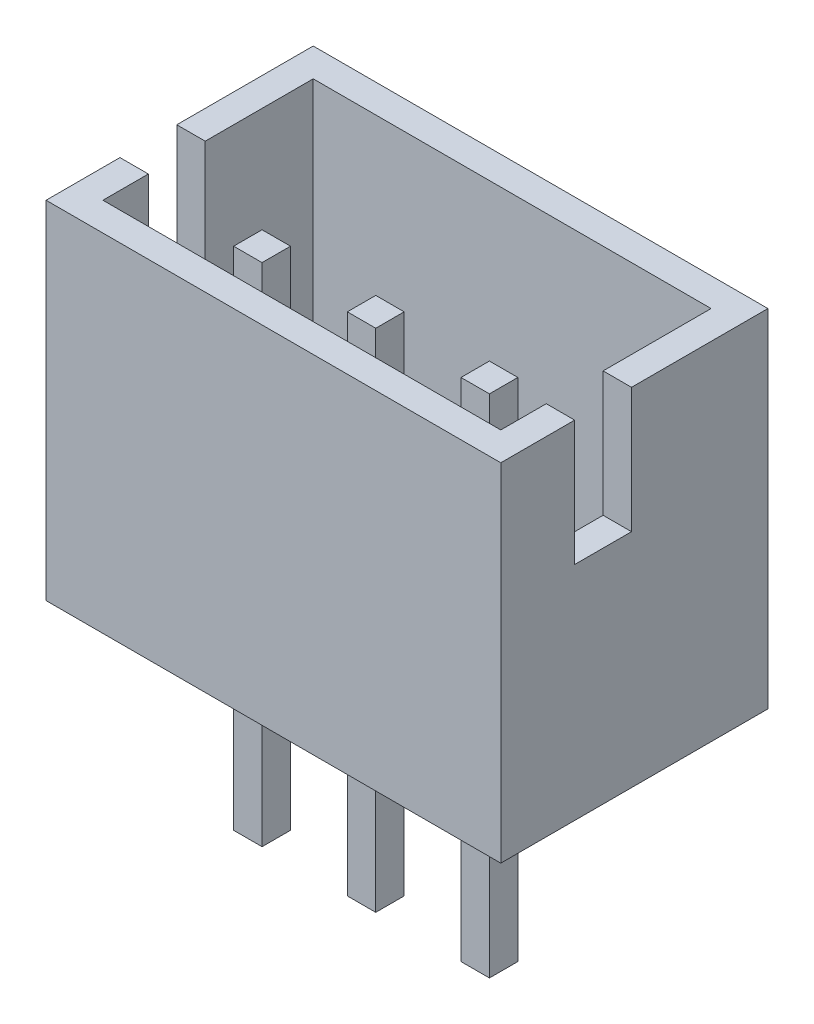
ISO-10303-21;
HEADER;
FILE_DESCRIPTION(('STEP AP214'),'2;1');
FILE_NAME('part.step','',(''),(''),'','','');
FILE_SCHEMA(('AUTOMOTIVE_DESIGN { 1 0 10303 214 1 1 1 1 }'));
ENDSEC;
DATA;
#1=APPLICATION_CONTEXT('core data for automotive mechanical design processes');
#2=APPLICATION_PROTOCOL_DEFINITION('international standard','automotive_design',2000,#1);
#3=PRODUCT_CONTEXT('',#1,'mechanical');
#4=PRODUCT('Part','Part','',(#3));
#5=PRODUCT_RELATED_PRODUCT_CATEGORY('part','',(#4));
#6=PRODUCT_DEFINITION_FORMATION('','',#4);
#7=PRODUCT_DEFINITION_CONTEXT('part definition',#1,'design');
#8=PRODUCT_DEFINITION('design','',#6,#7);
#9=PRODUCT_DEFINITION_SHAPE('','',#8);
#10=(LENGTH_UNIT() NAMED_UNIT(*) SI_UNIT(.MILLI.,.METRE.));
#11=(NAMED_UNIT(*) PLANE_ANGLE_UNIT() SI_UNIT($,.RADIAN.));
#12=(NAMED_UNIT(*) SI_UNIT($,.STERADIAN.) SOLID_ANGLE_UNIT());
#13=UNCERTAINTY_MEASURE_WITH_UNIT(LENGTH_MEASURE(1.E-05),#10,'distance_accuracy_value','');
#14=(GEOMETRIC_REPRESENTATION_CONTEXT(3) GLOBAL_UNCERTAINTY_ASSIGNED_CONTEXT((#13)) GLOBAL_UNIT_ASSIGNED_CONTEXT((#10,
#11,#12)) REPRESENTATION_CONTEXT('',''));
#15=CARTESIAN_POINT('',(0.,0.,0.));
#16=DIRECTION('',(0.,0.,1.));
#17=DIRECTION('',(1.,0.,0.));
#18=AXIS2_PLACEMENT_3D('',#15,#16,#17);
#19=CARTESIAN_POINT('',(2.25,-3.4,0.3));
#20=DIRECTION('',(0.,0.,-1.));
#21=DIRECTION('',(-1.,0.,0.));
#22=AXIS2_PLACEMENT_3D('',#19,#20,#21);
#23=PLANE('',#22);
#24=DIRECTION('',(0.,1.,0.));
#25=VECTOR('',#24,1.);
#26=CARTESIAN_POINT('',(1.75,-3.4,0.3));
#27=LINE('',#26,#25);
#28=CARTESIAN_POINT('',(1.75,-3.4,0.3));
#29=VERTEX_POINT('',#28);
#30=CARTESIAN_POINT('',(1.75,5.5,0.3));
#31=VERTEX_POINT('',#30);
#32=EDGE_CURVE('E48',#29,#31,#27,.T.);
#33=ORIENTED_EDGE('',*,*,#32,.T.);
#34=DIRECTION('',(-1.,0.,0.));
#35=VECTOR('',#34,1.);
#36=CARTESIAN_POINT('',(2.25,5.5,0.3));
#37=LINE('',#36,#35);
#38=CARTESIAN_POINT('',(2.25,5.5,0.3));
#39=VERTEX_POINT('',#38);
#40=EDGE_CURVE('E85',#39,#31,#37,.T.);
#41=ORIENTED_EDGE('',*,*,#40,.F.);
#42=DIRECTION('',(0.,1.,0.));
#43=VECTOR('',#42,1.);
#44=CARTESIAN_POINT('',(2.25,-3.4,0.3));
#45=LINE('',#44,#43);
#46=CARTESIAN_POINT('',(2.25,-3.4,0.3));
#47=VERTEX_POINT('',#46);
#48=EDGE_CURVE('E12',#47,#39,#45,.T.);
#49=ORIENTED_EDGE('',*,*,#48,.F.);
#50=DIRECTION('',(-1.,0.,0.));
#51=VECTOR('',#50,1.);
#52=CARTESIAN_POINT('',(2.25,-3.4,0.3));
#53=LINE('',#52,#51);
#54=EDGE_CURVE('E86',#47,#29,#53,.T.);
#55=ORIENTED_EDGE('',*,*,#54,.T.);
#56=EDGE_LOOP('',(#33,#41,#49,#55));
#57=FACE_BOUND('',#56,.T.);
#58=ADVANCED_FACE('F45',(#57),#23,.T.);
#59=CARTESIAN_POINT('',(2.25,-3.4,0.8));
#60=DIRECTION('',(1.,0.,0.));
#61=DIRECTION('',(0.,0.,-1.));
#62=AXIS2_PLACEMENT_3D('',#59,#60,#61);
#63=PLANE('',#62);
#64=ORIENTED_EDGE('',*,*,#48,.T.);
#65=DIRECTION('',(0.,0.,-1.));
#66=VECTOR('',#65,1.);
#67=CARTESIAN_POINT('',(2.25,5.5,0.8));
#68=LINE('',#67,#66);
#69=CARTESIAN_POINT('',(2.25,5.5,0.8));
#70=VERTEX_POINT('',#69);
#71=EDGE_CURVE('E102',#70,#39,#68,.T.);
#72=ORIENTED_EDGE('',*,*,#71,.F.);
#73=DIRECTION('',(0.,1.,0.));
#74=VECTOR('',#73,1.);
#75=CARTESIAN_POINT('',(2.25,-3.4,0.8));
#76=LINE('',#75,#74);
#77=CARTESIAN_POINT('',(2.25,-3.4,0.8));
#78=VERTEX_POINT('',#77);
#79=EDGE_CURVE('E53',#78,#70,#76,.T.);
#80=ORIENTED_EDGE('',*,*,#79,.F.);
#81=DIRECTION('',(0.,0.,-1.));
#82=VECTOR('',#81,1.);
#83=CARTESIAN_POINT('',(2.25,-3.4,0.8));
#84=LINE('',#83,#82);
#85=EDGE_CURVE('E91',#78,#47,#84,.T.);
#86=ORIENTED_EDGE('',*,*,#85,.T.);
#87=EDGE_LOOP('',(#64,#72,#80,#86));
#88=FACE_BOUND('',#87,.T.);
#89=ADVANCED_FACE('F117',(#88),#63,.T.);
#90=CARTESIAN_POINT('',(2.25,-3.4,0.8));
#91=DIRECTION('',(0.,0.,1.));
#92=DIRECTION('',(1.,0.,0.));
#93=AXIS2_PLACEMENT_3D('',#90,#91,#92);
#94=PLANE('',#93);
#95=ORIENTED_EDGE('',*,*,#79,.T.);
#96=DIRECTION('',(1.,0.,0.));
#97=VECTOR('',#96,1.);
#98=CARTESIAN_POINT('',(2.25,5.5,0.8));
#99=LINE('',#98,#97);
#100=CARTESIAN_POINT('',(1.75,5.5,0.8));
#101=VERTEX_POINT('',#100);
#102=EDGE_CURVE('E98',#101,#70,#99,.T.);
#103=ORIENTED_EDGE('',*,*,#102,.F.);
#104=DIRECTION('',(0.,1.,0.));
#105=VECTOR('',#104,1.);
#106=CARTESIAN_POINT('',(1.75,-3.4,0.8));
#107=LINE('',#106,#105);
#108=CARTESIAN_POINT('',(1.75,-3.4,0.8));
#109=VERTEX_POINT('',#108);
#110=EDGE_CURVE('E90',#109,#101,#107,.T.);
#111=ORIENTED_EDGE('',*,*,#110,.F.);
#112=DIRECTION('',(1.,0.,0.));
#113=VECTOR('',#112,1.);
#114=CARTESIAN_POINT('',(2.25,-3.4,0.8));
#115=LINE('',#114,#113);
#116=EDGE_CURVE('E110',#109,#78,#115,.T.);
#117=ORIENTED_EDGE('',*,*,#116,.T.);
#118=EDGE_LOOP('',(#95,#103,#111,#117));
#119=FACE_BOUND('',#118,.T.);
#120=ADVANCED_FACE('F114',(#119),#94,.T.);
#121=CARTESIAN_POINT('',(1.75,-3.4,0.8));
#122=DIRECTION('',(-1.,0.,0.));
#123=DIRECTION('',(0.,0.,1.));
#124=AXIS2_PLACEMENT_3D('',#121,#122,#123);
#125=PLANE('',#124);
#126=ORIENTED_EDGE('',*,*,#110,.T.);
#127=DIRECTION('',(0.,0.,1.));
#128=VECTOR('',#127,1.);
#129=CARTESIAN_POINT('',(1.75,5.5,0.8));
#130=LINE('',#129,#128);
#131=EDGE_CURVE('E93',#31,#101,#130,.T.);
#132=ORIENTED_EDGE('',*,*,#131,.F.);
#133=ORIENTED_EDGE('',*,*,#32,.F.);
#134=DIRECTION('',(0.,0.,1.));
#135=VECTOR('',#134,1.);
#136=CARTESIAN_POINT('',(1.75,-3.4,0.8));
#137=LINE('',#136,#135);
#138=EDGE_CURVE('E108',#29,#109,#137,.T.);
#139=ORIENTED_EDGE('',*,*,#138,.T.);
#140=EDGE_LOOP('',(#126,#132,#133,#139));
#141=FACE_BOUND('',#140,.T.);
#142=ADVANCED_FACE('F94',(#141),#125,.T.);
#143=CARTESIAN_POINT('',(0.,-3.4,0.));
#144=DIRECTION('',(0.,-1.,0.));
#145=DIRECTION('',(0.,0.,-1.));
#146=AXIS2_PLACEMENT_3D('',#143,#144,#145);
#147=PLANE('',#146);
#148=ORIENTED_EDGE('',*,*,#54,.F.);
#149=ORIENTED_EDGE('',*,*,#85,.F.);
#150=ORIENTED_EDGE('',*,*,#116,.F.);
#151=ORIENTED_EDGE('',*,*,#138,.F.);
#152=EDGE_LOOP('',(#148,#149,#150,#151));
#153=FACE_BOUND('',#152,.T.);
#154=ADVANCED_FACE('F119',(#153),#147,.T.);
#155=CARTESIAN_POINT('',(0.,5.5,0.));
#156=DIRECTION('',(0.,-1.,0.));
#157=DIRECTION('',(0.,0.,-1.));
#158=AXIS2_PLACEMENT_3D('',#155,#156,#157);
#159=PLANE('',#158);
#160=ORIENTED_EDGE('',*,*,#40,.T.);
#161=ORIENTED_EDGE('',*,*,#131,.T.);
#162=ORIENTED_EDGE('',*,*,#102,.T.);
#163=ORIENTED_EDGE('',*,*,#71,.T.);
#164=EDGE_LOOP('',(#160,#161,#162,#163));
#165=FACE_BOUND('',#164,.T.);
#166=ADVANCED_FACE('F101',(#165),#159,.F.);
#167=CLOSED_SHELL('',(#58,#89,#120,#142,#154,#166));
#168=MANIFOLD_SOLID_BREP('B2',#167);
#169=CARTESIAN_POINT('',(0.25,-3.4,0.3));
#170=DIRECTION('',(0.,0.,-1.));
#171=DIRECTION('',(-1.,0.,0.));
#172=AXIS2_PLACEMENT_3D('',#169,#170,#171);
#173=PLANE('',#172);
#174=DIRECTION('',(0.,1.,0.));
#175=VECTOR('',#174,1.);
#176=CARTESIAN_POINT('',(-0.25,-3.4,0.3));
#177=LINE('',#176,#175);
#178=CARTESIAN_POINT('',(-0.25,-3.4,0.3));
#179=VERTEX_POINT('',#178);
#180=CARTESIAN_POINT('',(-0.25,5.5,0.3));
#181=VERTEX_POINT('',#180);
#182=EDGE_CURVE('E181',#179,#181,#177,.T.);
#183=ORIENTED_EDGE('',*,*,#182,.T.);
#184=DIRECTION('',(-1.,0.,0.));
#185=VECTOR('',#184,1.);
#186=CARTESIAN_POINT('',(0.25,5.5,0.3));
#187=LINE('',#186,#185);
#188=CARTESIAN_POINT('',(0.25,5.5,0.3));
#189=VERTEX_POINT('',#188);
#190=EDGE_CURVE('E218',#189,#181,#187,.T.);
#191=ORIENTED_EDGE('',*,*,#190,.F.);
#192=DIRECTION('',(0.,1.,0.));
#193=VECTOR('',#192,1.);
#194=CARTESIAN_POINT('',(0.25,-3.4,0.3));
#195=LINE('',#194,#193);
#196=CARTESIAN_POINT('',(0.25,-3.4,0.3));
#197=VERTEX_POINT('',#196);
#198=EDGE_CURVE('E43',#197,#189,#195,.T.);
#199=ORIENTED_EDGE('',*,*,#198,.F.);
#200=DIRECTION('',(-1.,0.,0.));
#201=VECTOR('',#200,1.);
#202=CARTESIAN_POINT('',(0.25,-3.4,0.3));
#203=LINE('',#202,#201);
#204=EDGE_CURVE('E219',#197,#179,#203,.T.);
#205=ORIENTED_EDGE('',*,*,#204,.T.);
#206=EDGE_LOOP('',(#183,#191,#199,#205));
#207=FACE_BOUND('',#206,.T.);
#208=ADVANCED_FACE('F178',(#207),#173,.T.);
#209=CARTESIAN_POINT('',(0.25,-3.4,0.8));
#210=DIRECTION('',(1.,0.,0.));
#211=DIRECTION('',(0.,0.,-1.));
#212=AXIS2_PLACEMENT_3D('',#209,#210,#211);
#213=PLANE('',#212);
#214=ORIENTED_EDGE('',*,*,#198,.T.);
#215=DIRECTION('',(0.,0.,-1.));
#216=VECTOR('',#215,1.);
#217=CARTESIAN_POINT('',(0.25,5.5,0.8));
#218=LINE('',#217,#216);
#219=CARTESIAN_POINT('',(0.25,5.5,0.8));
#220=VERTEX_POINT('',#219);
#221=EDGE_CURVE('E235',#220,#189,#218,.T.);
#222=ORIENTED_EDGE('',*,*,#221,.F.);
#223=DIRECTION('',(0.,1.,0.));
#224=VECTOR('',#223,1.);
#225=CARTESIAN_POINT('',(0.25,-3.4,0.8));
#226=LINE('',#225,#224);
#227=CARTESIAN_POINT('',(0.25,-3.4,0.8));
#228=VERTEX_POINT('',#227);
#229=EDGE_CURVE('E186',#228,#220,#226,.T.);
#230=ORIENTED_EDGE('',*,*,#229,.F.);
#231=DIRECTION('',(0.,0.,-1.));
#232=VECTOR('',#231,1.);
#233=CARTESIAN_POINT('',(0.25,-3.4,0.8));
#234=LINE('',#233,#232);
#235=EDGE_CURVE('E224',#228,#197,#234,.T.);
#236=ORIENTED_EDGE('',*,*,#235,.T.);
#237=EDGE_LOOP('',(#214,#222,#230,#236));
#238=FACE_BOUND('',#237,.T.);
#239=ADVANCED_FACE('F250',(#238),#213,.T.);
#240=CARTESIAN_POINT('',(0.25,-3.4,0.8));
#241=DIRECTION('',(0.,0.,1.));
#242=DIRECTION('',(1.,0.,0.));
#243=AXIS2_PLACEMENT_3D('',#240,#241,#242);
#244=PLANE('',#243);
#245=ORIENTED_EDGE('',*,*,#229,.T.);
#246=DIRECTION('',(1.,0.,0.));
#247=VECTOR('',#246,1.);
#248=CARTESIAN_POINT('',(0.25,5.5,0.8));
#249=LINE('',#248,#247);
#250=CARTESIAN_POINT('',(-0.25,5.5,0.8));
#251=VERTEX_POINT('',#250);
#252=EDGE_CURVE('E231',#251,#220,#249,.T.);
#253=ORIENTED_EDGE('',*,*,#252,.F.);
#254=DIRECTION('',(0.,1.,0.));
#255=VECTOR('',#254,1.);
#256=CARTESIAN_POINT('',(-0.25,-3.4,0.8));
#257=LINE('',#256,#255);
#258=CARTESIAN_POINT('',(-0.25,-3.4,0.8));
#259=VERTEX_POINT('',#258);
#260=EDGE_CURVE('E223',#259,#251,#257,.T.);
#261=ORIENTED_EDGE('',*,*,#260,.F.);
#262=DIRECTION('',(1.,0.,0.));
#263=VECTOR('',#262,1.);
#264=CARTESIAN_POINT('',(0.25,-3.4,0.8));
#265=LINE('',#264,#263);
#266=EDGE_CURVE('E243',#259,#228,#265,.T.);
#267=ORIENTED_EDGE('',*,*,#266,.T.);
#268=EDGE_LOOP('',(#245,#253,#261,#267));
#269=FACE_BOUND('',#268,.T.);
#270=ADVANCED_FACE('F247',(#269),#244,.T.);
#271=CARTESIAN_POINT('',(-0.25,-3.4,0.8));
#272=DIRECTION('',(-1.,0.,0.));
#273=DIRECTION('',(0.,0.,1.));
#274=AXIS2_PLACEMENT_3D('',#271,#272,#273);
#275=PLANE('',#274);
#276=ORIENTED_EDGE('',*,*,#260,.T.);
#277=DIRECTION('',(0.,0.,1.));
#278=VECTOR('',#277,1.);
#279=CARTESIAN_POINT('',(-0.25,5.5,0.8));
#280=LINE('',#279,#278);
#281=EDGE_CURVE('E226',#181,#251,#280,.T.);
#282=ORIENTED_EDGE('',*,*,#281,.F.);
#283=ORIENTED_EDGE('',*,*,#182,.F.);
#284=DIRECTION('',(0.,0.,1.));
#285=VECTOR('',#284,1.);
#286=CARTESIAN_POINT('',(-0.25,-3.4,0.8));
#287=LINE('',#286,#285);
#288=EDGE_CURVE('E241',#179,#259,#287,.T.);
#289=ORIENTED_EDGE('',*,*,#288,.T.);
#290=EDGE_LOOP('',(#276,#282,#283,#289));
#291=FACE_BOUND('',#290,.T.);
#292=ADVANCED_FACE('F227',(#291),#275,.T.);
#293=CARTESIAN_POINT('',(0.,-3.4,0.));
#294=DIRECTION('',(0.,-1.,0.));
#295=DIRECTION('',(0.,0.,-1.));
#296=AXIS2_PLACEMENT_3D('',#293,#294,#295);
#297=PLANE('',#296);
#298=ORIENTED_EDGE('',*,*,#204,.F.);
#299=ORIENTED_EDGE('',*,*,#235,.F.);
#300=ORIENTED_EDGE('',*,*,#266,.F.);
#301=ORIENTED_EDGE('',*,*,#288,.F.);
#302=EDGE_LOOP('',(#298,#299,#300,#301));
#303=FACE_BOUND('',#302,.T.);
#304=ADVANCED_FACE('F252',(#303),#297,.T.);
#305=CARTESIAN_POINT('',(0.,5.5,0.));
#306=DIRECTION('',(0.,-1.,0.));
#307=DIRECTION('',(0.,0.,-1.));
#308=AXIS2_PLACEMENT_3D('',#305,#306,#307);
#309=PLANE('',#308);
#310=ORIENTED_EDGE('',*,*,#190,.T.);
#311=ORIENTED_EDGE('',*,*,#281,.T.);
#312=ORIENTED_EDGE('',*,*,#252,.T.);
#313=ORIENTED_EDGE('',*,*,#221,.T.);
#314=EDGE_LOOP('',(#310,#311,#312,#313));
#315=FACE_BOUND('',#314,.T.);
#316=ADVANCED_FACE('F234',(#315),#309,.F.);
#317=CLOSED_SHELL('',(#208,#239,#270,#292,#304,#316));
#318=MANIFOLD_SOLID_BREP('B6',#317);
#319=CARTESIAN_POINT('',(-2.25,-3.4,0.8));
#320=DIRECTION('',(-1.,0.,0.));
#321=DIRECTION('',(0.,0.,1.));
#322=AXIS2_PLACEMENT_3D('',#319,#320,#321);
#323=PLANE('',#322);
#324=DIRECTION('',(0.,1.,0.));
#325=VECTOR('',#324,1.);
#326=CARTESIAN_POINT('',(-2.25,-3.4,0.8));
#327=LINE('',#326,#325);
#328=CARTESIAN_POINT('',(-2.25,-3.4,0.8));
#329=VERTEX_POINT('',#328);
#330=CARTESIAN_POINT('',(-2.25,5.5,0.8));
#331=VERTEX_POINT('',#330);
#332=EDGE_CURVE('E313',#329,#331,#327,.T.);
#333=ORIENTED_EDGE('',*,*,#332,.T.);
#334=DIRECTION('',(0.,0.,1.));
#335=VECTOR('',#334,1.);
#336=CARTESIAN_POINT('',(-2.25,5.5,0.8));
#337=LINE('',#336,#335);
#338=CARTESIAN_POINT('',(-2.25,5.5,0.3));
#339=VERTEX_POINT('',#338);
#340=EDGE_CURVE('E350',#339,#331,#337,.T.);
#341=ORIENTED_EDGE('',*,*,#340,.F.);
#342=DIRECTION('',(0.,1.,0.));
#343=VECTOR('',#342,1.);
#344=CARTESIAN_POINT('',(-2.25,-3.4,0.3));
#345=LINE('',#344,#343);
#346=CARTESIAN_POINT('',(-2.25,-3.4,0.3));
#347=VERTEX_POINT('',#346);
#348=EDGE_CURVE('E176',#347,#339,#345,.T.);
#349=ORIENTED_EDGE('',*,*,#348,.F.);
#350=DIRECTION('',(0.,0.,1.));
#351=VECTOR('',#350,1.);
#352=CARTESIAN_POINT('',(-2.25,-3.4,0.8));
#353=LINE('',#352,#351);
#354=EDGE_CURVE('E351',#347,#329,#353,.T.);
#355=ORIENTED_EDGE('',*,*,#354,.T.);
#356=EDGE_LOOP('',(#333,#341,#349,#355));
#357=FACE_BOUND('',#356,.T.);
#358=ADVANCED_FACE('F310',(#357),#323,.T.);
#359=CARTESIAN_POINT('',(-1.75,-3.4,0.3));
#360=DIRECTION('',(0.,0.,-1.));
#361=DIRECTION('',(-1.,0.,0.));
#362=AXIS2_PLACEMENT_3D('',#359,#360,#361);
#363=PLANE('',#362);
#364=ORIENTED_EDGE('',*,*,#348,.T.);
#365=DIRECTION('',(-1.,0.,0.));
#366=VECTOR('',#365,1.);
#367=CARTESIAN_POINT('',(-1.75,5.5,0.3));
#368=LINE('',#367,#366);
#369=CARTESIAN_POINT('',(-1.75,5.5,0.3));
#370=VERTEX_POINT('',#369);
#371=EDGE_CURVE('E367',#370,#339,#368,.T.);
#372=ORIENTED_EDGE('',*,*,#371,.F.);
#373=DIRECTION('',(0.,1.,0.));
#374=VECTOR('',#373,1.);
#375=CARTESIAN_POINT('',(-1.75,-3.4,0.3));
#376=LINE('',#375,#374);
#377=CARTESIAN_POINT('',(-1.75,-3.4,0.3));
#378=VERTEX_POINT('',#377);
#379=EDGE_CURVE('E318',#378,#370,#376,.T.);
#380=ORIENTED_EDGE('',*,*,#379,.F.);
#381=DIRECTION('',(-1.,0.,0.));
#382=VECTOR('',#381,1.);
#383=CARTESIAN_POINT('',(-1.75,-3.4,0.3));
#384=LINE('',#383,#382);
#385=EDGE_CURVE('E356',#378,#347,#384,.T.);
#386=ORIENTED_EDGE('',*,*,#385,.T.);
#387=EDGE_LOOP('',(#364,#372,#380,#386));
#388=FACE_BOUND('',#387,.T.);
#389=ADVANCED_FACE('F382',(#388),#363,.T.);
#390=CARTESIAN_POINT('',(-1.75,-3.4,0.8));
#391=DIRECTION('',(1.,0.,0.));
#392=DIRECTION('',(0.,0.,-1.));
#393=AXIS2_PLACEMENT_3D('',#390,#391,#392);
#394=PLANE('',#393);
#395=ORIENTED_EDGE('',*,*,#379,.T.);
#396=DIRECTION('',(0.,0.,-1.));
#397=VECTOR('',#396,1.);
#398=CARTESIAN_POINT('',(-1.75,5.5,0.8));
#399=LINE('',#398,#397);
#400=CARTESIAN_POINT('',(-1.75,5.5,0.8));
#401=VERTEX_POINT('',#400);
#402=EDGE_CURVE('E363',#401,#370,#399,.T.);
#403=ORIENTED_EDGE('',*,*,#402,.F.);
#404=DIRECTION('',(0.,1.,0.));
#405=VECTOR('',#404,1.);
#406=CARTESIAN_POINT('',(-1.75,-3.4,0.8));
#407=LINE('',#406,#405);
#408=CARTESIAN_POINT('',(-1.75,-3.4,0.8));
#409=VERTEX_POINT('',#408);
#410=EDGE_CURVE('E355',#409,#401,#407,.T.);
#411=ORIENTED_EDGE('',*,*,#410,.F.);
#412=DIRECTION('',(0.,0.,-1.));
#413=VECTOR('',#412,1.);
#414=CARTESIAN_POINT('',(-1.75,-3.4,0.8));
#415=LINE('',#414,#413);
#416=EDGE_CURVE('E375',#409,#378,#415,.T.);
#417=ORIENTED_EDGE('',*,*,#416,.T.);
#418=EDGE_LOOP('',(#395,#403,#411,#417));
#419=FACE_BOUND('',#418,.T.);
#420=ADVANCED_FACE('F379',(#419),#394,.T.);
#421=CARTESIAN_POINT('',(-1.75,-3.4,0.8));
#422=DIRECTION('',(0.,0.,1.));
#423=DIRECTION('',(1.,0.,0.));
#424=AXIS2_PLACEMENT_3D('',#421,#422,#423);
#425=PLANE('',#424);
#426=ORIENTED_EDGE('',*,*,#410,.T.);
#427=DIRECTION('',(1.,0.,0.));
#428=VECTOR('',#427,1.);
#429=CARTESIAN_POINT('',(-1.75,5.5,0.8));
#430=LINE('',#429,#428);
#431=EDGE_CURVE('E358',#331,#401,#430,.T.);
#432=ORIENTED_EDGE('',*,*,#431,.F.);
#433=ORIENTED_EDGE('',*,*,#332,.F.);
#434=DIRECTION('',(1.,0.,0.));
#435=VECTOR('',#434,1.);
#436=CARTESIAN_POINT('',(-1.75,-3.4,0.8));
#437=LINE('',#436,#435);
#438=EDGE_CURVE('E373',#329,#409,#437,.T.);
#439=ORIENTED_EDGE('',*,*,#438,.T.);
#440=EDGE_LOOP('',(#426,#432,#433,#439));
#441=FACE_BOUND('',#440,.T.);
#442=ADVANCED_FACE('F359',(#441),#425,.T.);
#443=CARTESIAN_POINT('',(0.,-3.4,0.));
#444=DIRECTION('',(0.,1.,0.));
#445=DIRECTION('',(0.,0.,1.));
#446=AXIS2_PLACEMENT_3D('',#443,#444,#445);
#447=PLANE('',#446);
#448=ORIENTED_EDGE('',*,*,#354,.F.);
#449=ORIENTED_EDGE('',*,*,#385,.F.);
#450=ORIENTED_EDGE('',*,*,#416,.F.);
#451=ORIENTED_EDGE('',*,*,#438,.F.);
#452=EDGE_LOOP('',(#448,#449,#450,#451));
#453=FACE_BOUND('',#452,.T.);
#454=ADVANCED_FACE('F384',(#453),#447,.F.);
#455=CARTESIAN_POINT('',(0.,5.5,0.));
#456=DIRECTION('',(0.,1.,0.));
#457=DIRECTION('',(0.,0.,1.));
#458=AXIS2_PLACEMENT_3D('',#455,#456,#457);
#459=PLANE('',#458);
#460=ORIENTED_EDGE('',*,*,#340,.T.);
#461=ORIENTED_EDGE('',*,*,#431,.T.);
#462=ORIENTED_EDGE('',*,*,#402,.T.);
#463=ORIENTED_EDGE('',*,*,#371,.T.);
#464=EDGE_LOOP('',(#460,#461,#462,#463));
#465=FACE_BOUND('',#464,.T.);
#466=ADVANCED_FACE('F366',(#465),#459,.T.);
#467=CLOSED_SHELL('',(#358,#389,#420,#442,#454,#466));
#468=MANIFOLD_SOLID_BREP('B37',#467);
#469=CARTESIAN_POINT('',(4.,6.1,2.35));
#470=DIRECTION('',(-1.,0.,0.));
#471=DIRECTION('',(0.,0.,1.));
#472=AXIS2_PLACEMENT_3D('',#469,#470,#471);
#473=PLANE('',#472);
#474=DIRECTION('',(0.,1.,0.));
#475=VECTOR('',#474,1.);
#476=CARTESIAN_POINT('',(4.,3.9,1.05));
#477=LINE('',#476,#475);
#478=CARTESIAN_POINT('',(4.,3.9,1.05));
#479=VERTEX_POINT('',#478);
#480=CARTESIAN_POINT('',(4.,6.1,1.05));
#481=VERTEX_POINT('',#480);
#482=EDGE_CURVE('E552',#479,#481,#477,.T.);
#483=ORIENTED_EDGE('',*,*,#482,.T.);
#484=DIRECTION('',(0.,0.,-1.));
#485=VECTOR('',#484,1.);
#486=CARTESIAN_POINT('',(4.,6.1,2.35));
#487=LINE('',#486,#485);
#488=CARTESIAN_POINT('',(4.,6.1,2.35));
#489=VERTEX_POINT('',#488);
#490=EDGE_CURVE('E568',#489,#481,#487,.T.);
#491=ORIENTED_EDGE('',*,*,#490,.F.);
#492=DIRECTION('',(0.,-1.,0.));
#493=VECTOR('',#492,1.);
#494=CARTESIAN_POINT('',(4.,6.1,2.35));
#495=LINE('',#494,#493);
#496=CARTESIAN_POINT('',(4.,0.,2.35));
#497=VERTEX_POINT('',#496);
#498=EDGE_CURVE('E593',#489,#497,#495,.T.);
#499=ORIENTED_EDGE('',*,*,#498,.T.);
#500=DIRECTION('',(0.,0.,-1.));
#501=VECTOR('',#500,1.);
#502=CARTESIAN_POINT('',(4.,0.,2.35));
#503=LINE('',#502,#501);
#504=CARTESIAN_POINT('',(4.,0.,-2.35));
#505=VERTEX_POINT('',#504);
#506=EDGE_CURVE('E585',#497,#505,#503,.T.);
#507=ORIENTED_EDGE('',*,*,#506,.T.);
#508=DIRECTION('',(0.,-1.,0.));
#509=VECTOR('',#508,1.);
#510=CARTESIAN_POINT('',(4.,6.1,-2.35));
#511=LINE('',#510,#509);
#512=CARTESIAN_POINT('',(4.,6.1,-2.35));
#513=VERTEX_POINT('',#512);
#514=EDGE_CURVE('E566',#513,#505,#511,.T.);
#515=ORIENTED_EDGE('',*,*,#514,.F.);
#516=CARTESIAN_POINT('',(4.,6.1,0.0499999999999996));
#517=VERTEX_POINT('',#516);
#518=EDGE_CURVE('E557',#517,#513,#487,.T.);
#519=ORIENTED_EDGE('',*,*,#518,.F.);
#520=DIRECTION('',(0.,-1.,0.));
#521=VECTOR('',#520,1.);
#522=CARTESIAN_POINT('',(4.,3.9,0.0499999999999996));
#523=LINE('',#522,#521);
#524=CARTESIAN_POINT('',(4.,3.9,0.0499999999999996));
#525=VERTEX_POINT('',#524);
#526=EDGE_CURVE('E544',#517,#525,#523,.T.);
#527=ORIENTED_EDGE('',*,*,#526,.T.);
#528=DIRECTION('',(0.,0.,1.));
#529=VECTOR('',#528,1.);
#530=CARTESIAN_POINT('',(4.,3.9,1.05));
#531=LINE('',#530,#529);
#532=EDGE_CURVE('E562',#525,#479,#531,.T.);
#533=ORIENTED_EDGE('',*,*,#532,.T.);
#534=EDGE_LOOP('',(#483,#491,#499,#507,#515,#519,#527,#533));
#535=FACE_BOUND('',#534,.T.);
#536=ADVANCED_FACE('F433',(#535),#473,.F.);
#537=CARTESIAN_POINT('',(0.,6.1,0.));
#538=DIRECTION('',(0.,1.,0.));
#539=DIRECTION('',(0.,0.,1.));
#540=AXIS2_PLACEMENT_3D('',#537,#538,#539);
#541=PLANE('',#540);
#542=ORIENTED_EDGE('',*,*,#490,.T.);
#543=DIRECTION('',(1.,0.,0.));
#544=VECTOR('',#543,1.);
#545=CARTESIAN_POINT('',(-5.91660919471891,6.1,1.05));
#546=LINE('',#545,#544);
#547=CARTESIAN_POINT('',(3.5,6.1,1.05));
#548=VERTEX_POINT('',#547);
#549=EDGE_CURVE('E561',#548,#481,#546,.T.);
#550=ORIENTED_EDGE('',*,*,#549,.F.);
#551=DIRECTION('',(0.,0.,-1.));
#552=VECTOR('',#551,1.);
#553=CARTESIAN_POINT('',(3.5,6.1,2.35));
#554=LINE('',#553,#552);
#555=CARTESIAN_POINT('',(3.5,6.1,1.85));
#556=VERTEX_POINT('',#555);
#557=EDGE_CURVE('E668',#556,#548,#554,.T.);
#558=ORIENTED_EDGE('',*,*,#557,.F.);
#559=DIRECTION('',(1.,0.,0.));
#560=VECTOR('',#559,1.);
#561=CARTESIAN_POINT('',(4.,6.1,1.85));
#562=LINE('',#561,#560);
#563=CARTESIAN_POINT('',(-3.5,6.1,1.85));
#564=VERTEX_POINT('',#563);
#565=EDGE_CURVE('E666',#564,#556,#562,.T.);
#566=ORIENTED_EDGE('',*,*,#565,.F.);
#567=DIRECTION('',(0.,0.,1.));
#568=VECTOR('',#567,1.);
#569=CARTESIAN_POINT('',(-3.5,6.1,2.35));
#570=LINE('',#569,#568);
#571=CARTESIAN_POINT('',(-3.5,6.1,1.05));
#572=VERTEX_POINT('',#571);
#573=EDGE_CURVE('E662',#572,#564,#570,.T.);
#574=ORIENTED_EDGE('',*,*,#573,.F.);
#575=DIRECTION('',(-1.,0.,0.));
#576=VECTOR('',#575,1.);
#577=CARTESIAN_POINT('',(-1.08339080528109,6.1,1.05));
#578=LINE('',#577,#576);
#579=CARTESIAN_POINT('',(-4.,6.1,1.05));
#580=VERTEX_POINT('',#579);
#581=EDGE_CURVE('E635',#572,#580,#578,.T.);
#582=ORIENTED_EDGE('',*,*,#581,.T.);
#583=DIRECTION('',(0.,0.,1.));
#584=VECTOR('',#583,1.);
#585=CARTESIAN_POINT('',(-4.,6.1,2.35));
#586=LINE('',#585,#584);
#587=CARTESIAN_POINT('',(-4.,6.1,2.35));
#588=VERTEX_POINT('',#587);
#589=EDGE_CURVE('E589',#580,#588,#586,.T.);
#590=ORIENTED_EDGE('',*,*,#589,.T.);
#591=DIRECTION('',(1.,0.,0.));
#592=VECTOR('',#591,1.);
#593=CARTESIAN_POINT('',(4.,6.1,2.35));
#594=LINE('',#593,#592);
#595=EDGE_CURVE('E569',#588,#489,#594,.T.);
#596=ORIENTED_EDGE('',*,*,#595,.T.);
#597=EDGE_LOOP('',(#542,#550,#558,#566,#574,#582,#590,#596));
#598=FACE_BOUND('',#597,.T.);
#599=ADVANCED_FACE('F676',(#598),#541,.T.);
#600=CARTESIAN_POINT('',(3.5,6.1,0.0499999999999997));
#601=VERTEX_POINT('',#600);
#602=CARTESIAN_POINT('',(3.5,6.1,-1.85));
#603=VERTEX_POINT('',#602);
#604=EDGE_CURVE('E560',#601,#603,#554,.T.);
#605=ORIENTED_EDGE('',*,*,#604,.F.);
#606=DIRECTION('',(1.,0.,0.));
#607=VECTOR('',#606,1.);
#608=CARTESIAN_POINT('',(-5.91660919471891,6.1,0.0499999999999996));
#609=LINE('',#608,#607);
#610=EDGE_CURVE('E448',#601,#517,#609,.T.);
#611=ORIENTED_EDGE('',*,*,#610,.T.);
#612=ORIENTED_EDGE('',*,*,#518,.T.);
#613=DIRECTION('',(-1.,0.,0.));
#614=VECTOR('',#613,1.);
#615=CARTESIAN_POINT('',(4.,6.1,-2.35));
#616=LINE('',#615,#614);
#617=CARTESIAN_POINT('',(-4.,6.1,-2.35));
#618=VERTEX_POINT('',#617);
#619=EDGE_CURVE('E572',#513,#618,#616,.T.);
#620=ORIENTED_EDGE('',*,*,#619,.T.);
#621=CARTESIAN_POINT('',(-4.,6.1,0.0499999999999996));
#622=VERTEX_POINT('',#621);
#623=EDGE_CURVE('E573',#618,#622,#586,.T.);
#624=ORIENTED_EDGE('',*,*,#623,.T.);
#625=DIRECTION('',(-1.,0.,0.));
#626=VECTOR('',#625,1.);
#627=CARTESIAN_POINT('',(-1.08339080528109,6.1,0.0499999999999996));
#628=LINE('',#627,#626);
#629=CARTESIAN_POINT('',(-3.5,6.1,0.0499999999999995));
#630=VERTEX_POINT('',#629);
#631=EDGE_CURVE('E631',#630,#622,#628,.T.);
#632=ORIENTED_EDGE('',*,*,#631,.F.);
#633=CARTESIAN_POINT('',(-3.5,6.1,-1.85));
#634=VERTEX_POINT('',#633);
#635=EDGE_CURVE('E663',#634,#630,#570,.T.);
#636=ORIENTED_EDGE('',*,*,#635,.F.);
#637=DIRECTION('',(-1.,0.,0.));
#638=VECTOR('',#637,1.);
#639=CARTESIAN_POINT('',(4.,6.1,-1.85));
#640=LINE('',#639,#638);
#641=EDGE_CURVE('E652',#603,#634,#640,.T.);
#642=ORIENTED_EDGE('',*,*,#641,.F.);
#643=EDGE_LOOP('',(#605,#611,#612,#620,#624,#632,#636,#642));
#644=FACE_BOUND('',#643,.T.);
#645=ADVANCED_FACE('F556',(#644),#541,.T.);
#646=CARTESIAN_POINT('',(3.5,6.1,2.35));
#647=DIRECTION('',(-1.,0.,0.));
#648=DIRECTION('',(0.,0.,1.));
#649=AXIS2_PLACEMENT_3D('',#646,#647,#648);
#650=PLANE('',#649);
#651=ORIENTED_EDGE('',*,*,#557,.T.);
#652=DIRECTION('',(0.,-1.,0.));
#653=VECTOR('',#652,1.);
#654=CARTESIAN_POINT('',(3.5,6.1,1.05));
#655=LINE('',#654,#653);
#656=CARTESIAN_POINT('',(3.5,3.9,1.05));
#657=VERTEX_POINT('',#656);
#658=EDGE_CURVE('E308',#548,#657,#655,.T.);
#659=ORIENTED_EDGE('',*,*,#658,.T.);
#660=DIRECTION('',(0.,0.,-1.));
#661=VECTOR('',#660,1.);
#662=CARTESIAN_POINT('',(3.5,3.9,2.35));
#663=LINE('',#662,#661);
#664=CARTESIAN_POINT('',(3.5,3.9,0.0499999999999996));
#665=VERTEX_POINT('',#664);
#666=EDGE_CURVE('E441',#657,#665,#663,.T.);
#667=ORIENTED_EDGE('',*,*,#666,.T.);
#668=DIRECTION('',(0.,1.,0.));
#669=VECTOR('',#668,1.);
#670=CARTESIAN_POINT('',(3.5,6.1,0.0499999999999997));
#671=LINE('',#670,#669);
#672=EDGE_CURVE('E599',#665,#601,#671,.T.);
#673=ORIENTED_EDGE('',*,*,#672,.T.);
#674=ORIENTED_EDGE('',*,*,#604,.T.);
#675=DIRECTION('',(0.,-1.,0.));
#676=VECTOR('',#675,1.);
#677=CARTESIAN_POINT('',(3.5,6.1,-1.85));
#678=LINE('',#677,#676);
#679=CARTESIAN_POINT('',(3.5,0.5,-1.85));
#680=VERTEX_POINT('',#679);
#681=EDGE_CURVE('E651',#603,#680,#678,.T.);
#682=ORIENTED_EDGE('',*,*,#681,.T.);
#683=DIRECTION('',(0.,0.,-1.));
#684=VECTOR('',#683,1.);
#685=CARTESIAN_POINT('',(3.5,0.5,2.35));
#686=LINE('',#685,#684);
#687=CARTESIAN_POINT('',(3.5,0.5,1.85));
#688=VERTEX_POINT('',#687);
#689=EDGE_CURVE('E654',#688,#680,#686,.T.);
#690=ORIENTED_EDGE('',*,*,#689,.F.);
#691=DIRECTION('',(0.,-1.,0.));
#692=VECTOR('',#691,1.);
#693=CARTESIAN_POINT('',(3.5,6.1,1.85));
#694=LINE('',#693,#692);
#695=EDGE_CURVE('E647',#556,#688,#694,.T.);
#696=ORIENTED_EDGE('',*,*,#695,.F.);
#697=EDGE_LOOP('',(#651,#659,#667,#673,#674,#682,#690,#696));
#698=FACE_BOUND('',#697,.T.);
#699=ADVANCED_FACE('F603',(#698),#650,.T.);
#700=CARTESIAN_POINT('',(-4.,6.1,2.35));
#701=DIRECTION('',(1.,0.,0.));
#702=DIRECTION('',(0.,0.,-1.));
#703=AXIS2_PLACEMENT_3D('',#700,#701,#702);
#704=PLANE('',#703);
#705=ORIENTED_EDGE('',*,*,#589,.F.);
#706=DIRECTION('',(0.,1.,0.));
#707=VECTOR('',#706,1.);
#708=CARTESIAN_POINT('',(-4.,3.9,1.05));
#709=LINE('',#708,#707);
#710=CARTESIAN_POINT('',(-4.,3.9,1.05));
#711=VERTEX_POINT('',#710);
#712=EDGE_CURVE('E618',#711,#580,#709,.T.);
#713=ORIENTED_EDGE('',*,*,#712,.F.);
#714=DIRECTION('',(0.,0.,1.));
#715=VECTOR('',#714,1.);
#716=CARTESIAN_POINT('',(-4.,3.9,1.05));
#717=LINE('',#716,#715);
#718=CARTESIAN_POINT('',(-4.,3.9,0.0499999999999996));
#719=VERTEX_POINT('',#718);
#720=EDGE_CURVE('E621',#719,#711,#717,.T.);
#721=ORIENTED_EDGE('',*,*,#720,.F.);
#722=DIRECTION('',(0.,-1.,0.));
#723=VECTOR('',#722,1.);
#724=CARTESIAN_POINT('',(-4.,3.9,0.0499999999999996));
#725=LINE('',#724,#723);
#726=EDGE_CURVE('E613',#622,#719,#725,.T.);
#727=ORIENTED_EDGE('',*,*,#726,.F.);
#728=ORIENTED_EDGE('',*,*,#623,.F.);
#729=DIRECTION('',(0.,-1.,0.));
#730=VECTOR('',#729,1.);
#731=CARTESIAN_POINT('',(-4.,6.1,-2.35));
#732=LINE('',#731,#730);
#733=CARTESIAN_POINT('',(-4.,0.,-2.35));
#734=VERTEX_POINT('',#733);
#735=EDGE_CURVE('E578',#618,#734,#732,.T.);
#736=ORIENTED_EDGE('',*,*,#735,.T.);
#737=DIRECTION('',(0.,0.,1.));
#738=VECTOR('',#737,1.);
#739=CARTESIAN_POINT('',(-4.,0.,2.35));
#740=LINE('',#739,#738);
#741=CARTESIAN_POINT('',(-4.,0.,2.35));
#742=VERTEX_POINT('',#741);
#743=EDGE_CURVE('E579',#734,#742,#740,.T.);
#744=ORIENTED_EDGE('',*,*,#743,.T.);
#745=DIRECTION('',(0.,-1.,0.));
#746=VECTOR('',#745,1.);
#747=CARTESIAN_POINT('',(-4.,6.1,2.35));
#748=LINE('',#747,#746);
#749=EDGE_CURVE('E596',#588,#742,#748,.T.);
#750=ORIENTED_EDGE('',*,*,#749,.F.);
#751=EDGE_LOOP('',(#705,#713,#721,#727,#728,#736,#744,#750));
#752=FACE_BOUND('',#751,.T.);
#753=ADVANCED_FACE('F435',(#752),#704,.F.);
#754=CARTESIAN_POINT('',(4.,6.1,2.35));
#755=DIRECTION('',(0.,0.,-1.));
#756=DIRECTION('',(-1.,0.,0.));
#757=AXIS2_PLACEMENT_3D('',#754,#755,#756);
#758=PLANE('',#757);
#759=DIRECTION('',(1.,0.,0.));
#760=VECTOR('',#759,1.);
#761=CARTESIAN_POINT('',(4.,0.,2.35));
#762=LINE('',#761,#760);
#763=EDGE_CURVE('E582',#742,#497,#762,.T.);
#764=ORIENTED_EDGE('',*,*,#763,.T.);
#765=ORIENTED_EDGE('',*,*,#498,.F.);
#766=ORIENTED_EDGE('',*,*,#595,.F.);
#767=ORIENTED_EDGE('',*,*,#749,.T.);
#768=EDGE_LOOP('',(#764,#765,#766,#767));
#769=FACE_BOUND('',#768,.T.);
#770=ADVANCED_FACE('F683',(#769),#758,.F.);
#771=CARTESIAN_POINT('',(4.,6.1,-2.35));
#772=DIRECTION('',(0.,0.,1.));
#773=DIRECTION('',(1.,0.,0.));
#774=AXIS2_PLACEMENT_3D('',#771,#772,#773);
#775=PLANE('',#774);
#776=DIRECTION('',(-1.,0.,0.));
#777=VECTOR('',#776,1.);
#778=CARTESIAN_POINT('',(4.,0.,-2.35));
#779=LINE('',#778,#777);
#780=EDGE_CURVE('E587',#505,#734,#779,.T.);
#781=ORIENTED_EDGE('',*,*,#780,.T.);
#782=ORIENTED_EDGE('',*,*,#735,.F.);
#783=ORIENTED_EDGE('',*,*,#619,.F.);
#784=ORIENTED_EDGE('',*,*,#514,.T.);
#785=EDGE_LOOP('',(#781,#782,#783,#784));
#786=FACE_BOUND('',#785,.T.);
#787=ADVANCED_FACE('F732',(#786),#775,.F.);
#788=CARTESIAN_POINT('',(0.,0.,0.));
#789=DIRECTION('',(0.,1.,0.));
#790=DIRECTION('',(0.,0.,1.));
#791=AXIS2_PLACEMENT_3D('',#788,#789,#790);
#792=PLANE('',#791);
#793=ORIENTED_EDGE('',*,*,#743,.F.);
#794=ORIENTED_EDGE('',*,*,#780,.F.);
#795=ORIENTED_EDGE('',*,*,#506,.F.);
#796=ORIENTED_EDGE('',*,*,#763,.F.);
#797=EDGE_LOOP('',(#793,#794,#795,#796));
#798=FACE_BOUND('',#797,.T.);
#799=ADVANCED_FACE('F689',(#798),#792,.F.);
#800=CARTESIAN_POINT('',(-3.5,6.1,2.35));
#801=DIRECTION('',(1.,0.,0.));
#802=DIRECTION('',(0.,0.,-1.));
#803=AXIS2_PLACEMENT_3D('',#800,#801,#802);
#804=PLANE('',#803);
#805=DIRECTION('',(0.,1.,0.));
#806=VECTOR('',#805,1.);
#807=CARTESIAN_POINT('',(-3.5,3.9,1.05));
#808=LINE('',#807,#806);
#809=CARTESIAN_POINT('',(-3.5,3.9,1.05));
#810=VERTEX_POINT('',#809);
#811=EDGE_CURVE('E632',#810,#572,#808,.T.);
#812=ORIENTED_EDGE('',*,*,#811,.T.);
#813=ORIENTED_EDGE('',*,*,#573,.T.);
#814=DIRECTION('',(0.,-1.,0.));
#815=VECTOR('',#814,1.);
#816=CARTESIAN_POINT('',(-3.5,6.1,1.85));
#817=LINE('',#816,#815);
#818=CARTESIAN_POINT('',(-3.5,0.5,1.85));
#819=VERTEX_POINT('',#818);
#820=EDGE_CURVE('E583',#564,#819,#817,.T.);
#821=ORIENTED_EDGE('',*,*,#820,.T.);
#822=DIRECTION('',(0.,0.,1.));
#823=VECTOR('',#822,1.);
#824=CARTESIAN_POINT('',(-3.5,0.5,2.35));
#825=LINE('',#824,#823);
#826=CARTESIAN_POINT('',(-3.5,0.5,-1.85));
#827=VERTEX_POINT('',#826);
#828=EDGE_CURVE('E641',#827,#819,#825,.T.);
#829=ORIENTED_EDGE('',*,*,#828,.F.);
#830=DIRECTION('',(0.,-1.,0.));
#831=VECTOR('',#830,1.);
#832=CARTESIAN_POINT('',(-3.5,6.1,-1.85));
#833=LINE('',#832,#831);
#834=EDGE_CURVE('E648',#634,#827,#833,.T.);
#835=ORIENTED_EDGE('',*,*,#834,.F.);
#836=ORIENTED_EDGE('',*,*,#635,.T.);
#837=DIRECTION('',(0.,-1.,0.));
#838=VECTOR('',#837,1.);
#839=CARTESIAN_POINT('',(-3.5,3.9,0.0499999999999996));
#840=LINE('',#839,#838);
#841=CARTESIAN_POINT('',(-3.5,3.9,0.0499999999999997));
#842=VERTEX_POINT('',#841);
#843=EDGE_CURVE('E628',#630,#842,#840,.T.);
#844=ORIENTED_EDGE('',*,*,#843,.T.);
#845=DIRECTION('',(0.,0.,1.));
#846=VECTOR('',#845,1.);
#847=CARTESIAN_POINT('',(-3.5,3.9,1.05));
#848=LINE('',#847,#846);
#849=EDGE_CURVE('E620',#842,#810,#848,.T.);
#850=ORIENTED_EDGE('',*,*,#849,.T.);
#851=EDGE_LOOP('',(#812,#813,#821,#829,#835,#836,#844,#850));
#852=FACE_BOUND('',#851,.T.);
#853=ADVANCED_FACE('F699',(#852),#804,.T.);
#854=CARTESIAN_POINT('',(4.,6.1,1.85));
#855=DIRECTION('',(0.,0.,-1.));
#856=DIRECTION('',(-1.,0.,0.));
#857=AXIS2_PLACEMENT_3D('',#854,#855,#856);
#858=PLANE('',#857);
#859=DIRECTION('',(1.,0.,0.));
#860=VECTOR('',#859,1.);
#861=CARTESIAN_POINT('',(4.,0.5,1.85));
#862=LINE('',#861,#860);
#863=EDGE_CURVE('E644',#819,#688,#862,.T.);
#864=ORIENTED_EDGE('',*,*,#863,.F.);
#865=ORIENTED_EDGE('',*,*,#820,.F.);
#866=ORIENTED_EDGE('',*,*,#565,.T.);
#867=ORIENTED_EDGE('',*,*,#695,.T.);
#868=EDGE_LOOP('',(#864,#865,#866,#867));
#869=FACE_BOUND('',#868,.T.);
#870=ADVANCED_FACE('F696',(#869),#858,.T.);
#871=CARTESIAN_POINT('',(4.,6.1,-1.85));
#872=DIRECTION('',(0.,0.,1.));
#873=DIRECTION('',(1.,0.,0.));
#874=AXIS2_PLACEMENT_3D('',#871,#872,#873);
#875=PLANE('',#874);
#876=DIRECTION('',(-1.,0.,0.));
#877=VECTOR('',#876,1.);
#878=CARTESIAN_POINT('',(4.,0.5,-1.85));
#879=LINE('',#878,#877);
#880=EDGE_CURVE('E658',#680,#827,#879,.T.);
#881=ORIENTED_EDGE('',*,*,#880,.F.);
#882=ORIENTED_EDGE('',*,*,#681,.F.);
#883=ORIENTED_EDGE('',*,*,#641,.T.);
#884=ORIENTED_EDGE('',*,*,#834,.T.);
#885=EDGE_LOOP('',(#881,#882,#883,#884));
#886=FACE_BOUND('',#885,.T.);
#887=ADVANCED_FACE('F713',(#886),#875,.T.);
#888=CARTESIAN_POINT('',(0.,0.5,0.));
#889=DIRECTION('',(0.,1.,0.));
#890=DIRECTION('',(0.,0.,1.));
#891=AXIS2_PLACEMENT_3D('',#888,#889,#890);
#892=PLANE('',#891);
#893=ORIENTED_EDGE('',*,*,#828,.T.);
#894=ORIENTED_EDGE('',*,*,#863,.T.);
#895=ORIENTED_EDGE('',*,*,#689,.T.);
#896=ORIENTED_EDGE('',*,*,#880,.T.);
#897=EDGE_LOOP('',(#893,#894,#895,#896));
#898=FACE_BOUND('',#897,.T.);
#899=ADVANCED_FACE('F716',(#898),#892,.T.);
#900=CARTESIAN_POINT('',(-1.08339080528109,3.9,1.05));
#901=DIRECTION('',(0.,-1.,0.));
#902=DIRECTION('',(0.,0.,-1.));
#903=AXIS2_PLACEMENT_3D('',#900,#901,#902);
#904=PLANE('',#903);
#905=DIRECTION('',(-1.,0.,0.));
#906=VECTOR('',#905,1.);
#907=CARTESIAN_POINT('',(-1.08339080528109,3.9,0.0499999999999996));
#908=LINE('',#907,#906);
#909=EDGE_CURVE('E456',#842,#719,#908,.T.);
#910=ORIENTED_EDGE('',*,*,#909,.T.);
#911=ORIENTED_EDGE('',*,*,#720,.T.);
#912=DIRECTION('',(-1.,0.,0.));
#913=VECTOR('',#912,1.);
#914=CARTESIAN_POINT('',(-1.08339080528109,3.9,1.05));
#915=LINE('',#914,#913);
#916=EDGE_CURVE('E627',#810,#711,#915,.T.);
#917=ORIENTED_EDGE('',*,*,#916,.F.);
#918=ORIENTED_EDGE('',*,*,#849,.F.);
#919=EDGE_LOOP('',(#910,#911,#917,#918));
#920=FACE_BOUND('',#919,.T.);
#921=ADVANCED_FACE('F705',(#920),#904,.F.);
#922=CARTESIAN_POINT('',(-1.08339080528109,3.9,1.05));
#923=DIRECTION('',(0.,0.,1.));
#924=DIRECTION('',(1.,0.,0.));
#925=AXIS2_PLACEMENT_3D('',#922,#923,#924);
#926=PLANE('',#925);
#927=ORIENTED_EDGE('',*,*,#916,.T.);
#928=ORIENTED_EDGE('',*,*,#712,.T.);
#929=ORIENTED_EDGE('',*,*,#581,.F.);
#930=ORIENTED_EDGE('',*,*,#811,.F.);
#931=EDGE_LOOP('',(#927,#928,#929,#930));
#932=FACE_BOUND('',#931,.T.);
#933=ADVANCED_FACE('F703',(#932),#926,.F.);
#934=CARTESIAN_POINT('',(-1.08339080528109,3.9,0.0499999999999996));
#935=DIRECTION('',(0.,0.,-1.));
#936=DIRECTION('',(-1.,0.,0.));
#937=AXIS2_PLACEMENT_3D('',#934,#935,#936);
#938=PLANE('',#937);
#939=ORIENTED_EDGE('',*,*,#631,.T.);
#940=ORIENTED_EDGE('',*,*,#726,.T.);
#941=ORIENTED_EDGE('',*,*,#909,.F.);
#942=ORIENTED_EDGE('',*,*,#843,.F.);
#943=EDGE_LOOP('',(#939,#940,#941,#942));
#944=FACE_BOUND('',#943,.T.);
#945=ADVANCED_FACE('F708',(#944),#938,.F.);
#946=CARTESIAN_POINT('',(-5.91660919471891,3.9,1.05));
#947=DIRECTION('',(0.,0.,-1.));
#948=DIRECTION('',(-1.,0.,0.));
#949=AXIS2_PLACEMENT_3D('',#946,#947,#948);
#950=PLANE('',#949);
#951=ORIENTED_EDGE('',*,*,#549,.T.);
#952=ORIENTED_EDGE('',*,*,#482,.F.);
#953=DIRECTION('',(1.,0.,0.));
#954=VECTOR('',#953,1.);
#955=CARTESIAN_POINT('',(-5.91660919471891,3.9,1.05));
#956=LINE('',#955,#954);
#957=EDGE_CURVE('E607',#657,#479,#956,.T.);
#958=ORIENTED_EDGE('',*,*,#957,.F.);
#959=ORIENTED_EDGE('',*,*,#658,.F.);
#960=EDGE_LOOP('',(#951,#952,#958,#959));
#961=FACE_BOUND('',#960,.T.);
#962=ADVANCED_FACE('F610',(#961),#950,.T.);
#963=CARTESIAN_POINT('',(-5.91660919471891,3.9,1.05));
#964=DIRECTION('',(0.,1.,0.));
#965=DIRECTION('',(0.,0.,1.));
#966=AXIS2_PLACEMENT_3D('',#963,#964,#965);
#967=PLANE('',#966);
#968=ORIENTED_EDGE('',*,*,#957,.T.);
#969=ORIENTED_EDGE('',*,*,#532,.F.);
#970=DIRECTION('',(1.,0.,0.));
#971=VECTOR('',#970,1.);
#972=CARTESIAN_POINT('',(-5.91660919471891,3.9,0.0499999999999996));
#973=LINE('',#972,#971);
#974=EDGE_CURVE('E547',#665,#525,#973,.T.);
#975=ORIENTED_EDGE('',*,*,#974,.F.);
#976=ORIENTED_EDGE('',*,*,#666,.F.);
#977=EDGE_LOOP('',(#968,#969,#975,#976));
#978=FACE_BOUND('',#977,.T.);
#979=ADVANCED_FACE('F606',(#978),#967,.T.);
#980=CARTESIAN_POINT('',(-5.91660919471891,3.9,0.0499999999999996));
#981=DIRECTION('',(0.,0.,1.));
#982=DIRECTION('',(1.,0.,0.));
#983=AXIS2_PLACEMENT_3D('',#980,#981,#982);
#984=PLANE('',#983);
#985=ORIENTED_EDGE('',*,*,#974,.T.);
#986=ORIENTED_EDGE('',*,*,#526,.F.);
#987=ORIENTED_EDGE('',*,*,#610,.F.);
#988=ORIENTED_EDGE('',*,*,#672,.F.);
#989=EDGE_LOOP('',(#985,#986,#987,#988));
#990=FACE_BOUND('',#989,.T.);
#991=ADVANCED_FACE('F545',(#990),#984,.T.);
#992=CLOSED_SHELL('',(#536,#599,#645,#699,#753,#770,#787,#799,#853,#870,#887,#899,#921,#933,
#945,#962,#979,#991));
#993=MANIFOLD_SOLID_BREP('B170',#992);
#994=ADVANCED_BREP_SHAPE_REPRESENTATION('',(#18,#168,#318,#468,#993),#14);
#995=SHAPE_DEFINITION_REPRESENTATION(#9,#994);
ENDSEC;
END-ISO-10303-21;
